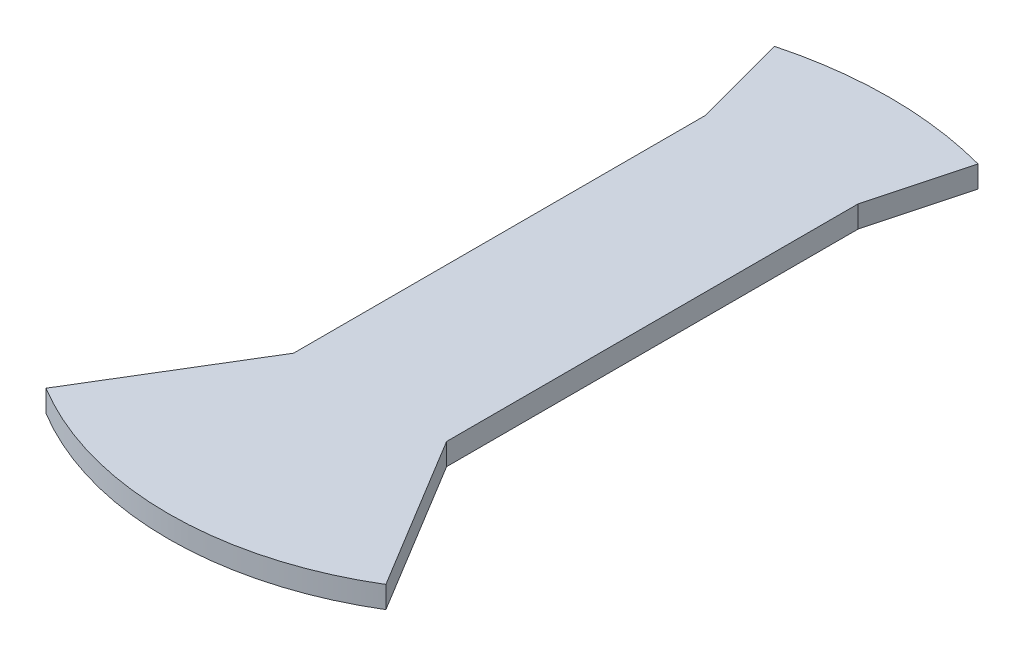
ISO-10303-21;
HEADER;
FILE_DESCRIPTION(('STEP AP214'),'2;1');
FILE_NAME('part.step','',(''),(''),'','','');
FILE_SCHEMA(('AUTOMOTIVE_DESIGN { 1 0 10303 214 1 1 1 1 }'));
ENDSEC;
DATA;
#1=APPLICATION_CONTEXT('core data for automotive mechanical design processes');
#2=APPLICATION_PROTOCOL_DEFINITION('international standard','automotive_design',2000,#1);
#3=PRODUCT_CONTEXT('',#1,'mechanical');
#4=PRODUCT('Part','Part','',(#3));
#5=PRODUCT_RELATED_PRODUCT_CATEGORY('part','',(#4));
#6=PRODUCT_DEFINITION_FORMATION('','',#4);
#7=PRODUCT_DEFINITION_CONTEXT('part definition',#1,'design');
#8=PRODUCT_DEFINITION('design','',#6,#7);
#9=PRODUCT_DEFINITION_SHAPE('','',#8);
#10=(LENGTH_UNIT() NAMED_UNIT(*) SI_UNIT(.MILLI.,.METRE.));
#11=(NAMED_UNIT(*) PLANE_ANGLE_UNIT() SI_UNIT($,.RADIAN.));
#12=(NAMED_UNIT(*) SI_UNIT($,.STERADIAN.) SOLID_ANGLE_UNIT());
#13=UNCERTAINTY_MEASURE_WITH_UNIT(LENGTH_MEASURE(1.E-05),#10,'distance_accuracy_value','');
#14=(GEOMETRIC_REPRESENTATION_CONTEXT(3) GLOBAL_UNCERTAINTY_ASSIGNED_CONTEXT((#13)) GLOBAL_UNIT_ASSIGNED_CONTEXT((#10,
#11,#12)) REPRESENTATION_CONTEXT('',''));
#15=CARTESIAN_POINT('',(0.,0.,0.));
#16=DIRECTION('',(0.,0.,1.));
#17=DIRECTION('',(1.,0.,0.));
#18=AXIS2_PLACEMENT_3D('',#15,#16,#17);
#19=CARTESIAN_POINT('',(0.,3.175,0.));
#20=DIRECTION('',(0.,-1.,0.));
#21=DIRECTION('',(0.,0.,-1.));
#22=AXIS2_PLACEMENT_3D('',#19,#20,#21);
#23=CYLINDRICAL_SURFACE('',#22,114.3);
#24=CARTESIAN_POINT('',(0.,-3.175,0.));
#25=DIRECTION('',(0.,1.,0.));
#26=DIRECTION('',(0.,0.,-1.));
#27=AXIS2_PLACEMENT_3D('',#24,#25,#26);
#28=CIRCLE('',#27,114.3);
#29=CARTESIAN_POINT('',(29.5830168552182,-3.175,-110.405321944841));
#30=VERTEX_POINT('',#29);
#31=CARTESIAN_POINT('',(-29.5830168552182,-3.175,-110.40532194484));
#32=VERTEX_POINT('',#31);
#33=EDGE_CURVE('E131',#30,#32,#28,.T.);
#34=ORIENTED_EDGE('',*,*,#33,.T.);
#35=DIRECTION('',(0.,-1.,0.));
#36=VECTOR('',#35,1.);
#37=CARTESIAN_POINT('',(-29.5830168552182,3.175,-110.40532194484));
#38=LINE('',#37,#36);
#39=CARTESIAN_POINT('',(-29.5830168552182,3.175,-110.40532194484));
#40=VERTEX_POINT('',#39);
#41=EDGE_CURVE('E11',#40,#32,#38,.T.);
#42=ORIENTED_EDGE('',*,*,#41,.F.);
#43=CARTESIAN_POINT('',(0.,3.175,0.));
#44=DIRECTION('',(0.,1.,0.));
#45=DIRECTION('',(0.,0.,-1.));
#46=AXIS2_PLACEMENT_3D('',#43,#44,#45);
#47=CIRCLE('',#46,114.3);
#48=CARTESIAN_POINT('',(29.5830168552182,3.175,-110.405321944841));
#49=VERTEX_POINT('',#48);
#50=EDGE_CURVE('E145',#49,#40,#47,.T.);
#51=ORIENTED_EDGE('',*,*,#50,.F.);
#52=DIRECTION('',(0.,-1.,0.));
#53=VECTOR('',#52,1.);
#54=CARTESIAN_POINT('',(29.5830168552182,3.175,-110.405321944841));
#55=LINE('',#54,#53);
#56=EDGE_CURVE('E127',#49,#30,#55,.T.);
#57=ORIENTED_EDGE('',*,*,#56,.T.);
#58=EDGE_LOOP('',(#34,#42,#51,#57));
#59=FACE_BOUND('',#58,.T.);
#60=ADVANCED_FACE('F35',(#59),#23,.T.);
#61=CARTESIAN_POINT('',(-29.5830168552182,3.175,-110.40532194484));
#62=DIRECTION('',(0.965925826289068,0.,-0.258819045102522));
#63=DIRECTION('',(-0.258819045102522,0.,-0.965925826289068));
#64=AXIS2_PLACEMENT_3D('',#61,#62,#63);
#65=PLANE('',#64);
#66=DIRECTION('',(0.258819045102522,0.,0.965925826289068));
#67=VECTOR('',#66,1.);
#68=CARTESIAN_POINT('',(-29.5830168552182,-3.175,-110.40532194484));
#69=LINE('',#68,#67);
#70=CARTESIAN_POINT('',(-22.225,-3.175,-82.944829198218));
#71=VERTEX_POINT('',#70);
#72=EDGE_CURVE('E134',#32,#71,#69,.T.);
#73=ORIENTED_EDGE('',*,*,#72,.T.);
#74=DIRECTION('',(0.,-1.,0.));
#75=VECTOR('',#74,1.);
#76=CARTESIAN_POINT('',(-22.225,3.175,-82.944829198218));
#77=LINE('',#76,#75);
#78=CARTESIAN_POINT('',(-22.225,3.175,-82.944829198218));
#79=VERTEX_POINT('',#78);
#80=EDGE_CURVE('E43',#79,#71,#77,.T.);
#81=ORIENTED_EDGE('',*,*,#80,.F.);
#82=DIRECTION('',(0.258819045102522,0.,0.965925826289068));
#83=VECTOR('',#82,1.);
#84=CARTESIAN_POINT('',(-29.5830168552182,3.175,-110.40532194484));
#85=LINE('',#84,#83);
#86=EDGE_CURVE('E94',#40,#79,#85,.T.);
#87=ORIENTED_EDGE('',*,*,#86,.F.);
#88=ORIENTED_EDGE('',*,*,#41,.T.);
#89=EDGE_LOOP('',(#73,#81,#87,#88));
#90=FACE_BOUND('',#89,.T.);
#91=ADVANCED_FACE('F180',(#90),#65,.F.);
#92=CARTESIAN_POINT('',(-22.225,3.175,-82.944829198218));
#93=DIRECTION('',(1.,0.,0.));
#94=DIRECTION('',(0.,0.,-1.));
#95=AXIS2_PLACEMENT_3D('',#92,#93,#94);
#96=PLANE('',#95);
#97=DIRECTION('',(0.,0.,1.));
#98=VECTOR('',#97,1.);
#99=CARTESIAN_POINT('',(-22.225,-3.175,-82.944829198218));
#100=LINE('',#99,#98);
#101=CARTESIAN_POINT('',(-22.225,-3.175,36.6590574958511));
#102=VERTEX_POINT('',#101);
#103=EDGE_CURVE('E136',#71,#102,#100,.T.);
#104=ORIENTED_EDGE('',*,*,#103,.T.);
#105=DIRECTION('',(0.,-1.,0.));
#106=VECTOR('',#105,1.);
#107=CARTESIAN_POINT('',(-22.225,3.175,36.6590574958511));
#108=LINE('',#107,#106);
#109=CARTESIAN_POINT('',(-22.225,3.175,36.6590574958511));
#110=VERTEX_POINT('',#109);
#111=EDGE_CURVE('E152',#110,#102,#108,.T.);
#112=ORIENTED_EDGE('',*,*,#111,.F.);
#113=DIRECTION('',(0.,0.,1.));
#114=VECTOR('',#113,1.);
#115=CARTESIAN_POINT('',(-22.225,3.175,-82.944829198218));
#116=LINE('',#115,#114);
#117=EDGE_CURVE('E160',#79,#110,#116,.T.);
#118=ORIENTED_EDGE('',*,*,#117,.F.);
#119=ORIENTED_EDGE('',*,*,#80,.T.);
#120=EDGE_LOOP('',(#104,#112,#118,#119));
#121=FACE_BOUND('',#120,.T.);
#122=ADVANCED_FACE('F158',(#121),#96,.F.);
#123=CARTESIAN_POINT('',(-22.225,3.175,36.6590574958511));
#124=DIRECTION('',(0.85512142026816,0.,0.51842777375307));
#125=DIRECTION('',(0.51842777375307,0.,-0.85512142026816));
#126=AXIS2_PLACEMENT_3D('',#123,#124,#125);
#127=PLANE('',#126);
#128=DIRECTION('',(-0.51842777375307,0.,0.85512142026816));
#129=VECTOR('',#128,1.);
#130=CARTESIAN_POINT('',(-22.225,-3.175,36.6590574958511));
#131=LINE('',#130,#129);
#132=CARTESIAN_POINT('',(-49.3802454499799,-3.175,81.4503152805423));
#133=VERTEX_POINT('',#132);
#134=EDGE_CURVE('E138',#102,#133,#131,.T.);
#135=ORIENTED_EDGE('',*,*,#134,.T.);
#136=DIRECTION('',(0.,-1.,0.));
#137=VECTOR('',#136,1.);
#138=CARTESIAN_POINT('',(-49.3802454499799,3.175,81.4503152805423));
#139=LINE('',#138,#137);
#140=CARTESIAN_POINT('',(-49.3802454499799,3.175,81.4503152805423));
#141=VERTEX_POINT('',#140);
#142=EDGE_CURVE('E149',#141,#133,#139,.T.);
#143=ORIENTED_EDGE('',*,*,#142,.F.);
#144=DIRECTION('',(-0.51842777375307,0.,0.85512142026816));
#145=VECTOR('',#144,1.);
#146=CARTESIAN_POINT('',(-22.225,3.175,36.6590574958511));
#147=LINE('',#146,#145);
#148=EDGE_CURVE('E172',#110,#141,#147,.T.);
#149=ORIENTED_EDGE('',*,*,#148,.F.);
#150=ORIENTED_EDGE('',*,*,#111,.T.);
#151=EDGE_LOOP('',(#135,#143,#149,#150));
#152=FACE_BOUND('',#151,.T.);
#153=ADVANCED_FACE('F168',(#152),#127,.F.);
#154=CARTESIAN_POINT('',(0.,3.175,0.));
#155=DIRECTION('',(0.,-1.,0.));
#156=DIRECTION('',(0.,0.,-1.));
#157=AXIS2_PLACEMENT_3D('',#154,#155,#156);
#158=CYLINDRICAL_SURFACE('',#157,95.25);
#159=CARTESIAN_POINT('',(0.,-3.175,0.));
#160=DIRECTION('',(0.,1.,0.));
#161=DIRECTION('',(0.,0.,1.));
#162=AXIS2_PLACEMENT_3D('',#159,#160,#161);
#163=CIRCLE('',#162,95.25);
#164=CARTESIAN_POINT('',(49.38024544998,-3.175,81.4503152805422));
#165=VERTEX_POINT('',#164);
#166=EDGE_CURVE('E140',#133,#165,#163,.T.);
#167=ORIENTED_EDGE('',*,*,#166,.T.);
#168=DIRECTION('',(0.,-1.,0.));
#169=VECTOR('',#168,1.);
#170=CARTESIAN_POINT('',(49.38024544998,3.175,81.4503152805422));
#171=LINE('',#170,#169);
#172=CARTESIAN_POINT('',(49.38024544998,3.175,81.4503152805422));
#173=VERTEX_POINT('',#172);
#174=EDGE_CURVE('E122',#173,#165,#171,.T.);
#175=ORIENTED_EDGE('',*,*,#174,.F.);
#176=CARTESIAN_POINT('',(0.,3.175,0.));
#177=DIRECTION('',(0.,1.,0.));
#178=DIRECTION('',(0.,0.,1.));
#179=AXIS2_PLACEMENT_3D('',#176,#177,#178);
#180=CIRCLE('',#179,95.25);
#181=EDGE_CURVE('E113',#141,#173,#180,.T.);
#182=ORIENTED_EDGE('',*,*,#181,.F.);
#183=ORIENTED_EDGE('',*,*,#142,.T.);
#184=EDGE_LOOP('',(#167,#175,#182,#183));
#185=FACE_BOUND('',#184,.T.);
#186=ADVANCED_FACE('F171',(#185),#158,.T.);
#187=CARTESIAN_POINT('',(22.225,3.175,36.659057495851));
#188=DIRECTION('',(-0.85512142026816,0.,0.51842777375307));
#189=DIRECTION('',(0.51842777375307,0.,0.85512142026816));
#190=AXIS2_PLACEMENT_3D('',#187,#188,#189);
#191=PLANE('',#190);
#192=DIRECTION('',(-0.51842777375307,0.,-0.85512142026816));
#193=VECTOR('',#192,1.);
#194=CARTESIAN_POINT('',(22.225,-3.175,36.659057495851));
#195=LINE('',#194,#193);
#196=CARTESIAN_POINT('',(22.225,-3.175,36.659057495851));
#197=VERTEX_POINT('',#196);
#198=EDGE_CURVE('E121',#165,#197,#195,.T.);
#199=ORIENTED_EDGE('',*,*,#198,.T.);
#200=DIRECTION('',(0.,-1.,0.));
#201=VECTOR('',#200,1.);
#202=CARTESIAN_POINT('',(22.225,3.175,36.659057495851));
#203=LINE('',#202,#201);
#204=CARTESIAN_POINT('',(22.225,3.175,36.659057495851));
#205=VERTEX_POINT('',#204);
#206=EDGE_CURVE('E118',#205,#197,#203,.T.);
#207=ORIENTED_EDGE('',*,*,#206,.F.);
#208=DIRECTION('',(-0.51842777375307,0.,-0.85512142026816));
#209=VECTOR('',#208,1.);
#210=CARTESIAN_POINT('',(22.225,3.175,36.659057495851));
#211=LINE('',#210,#209);
#212=EDGE_CURVE('E107',#173,#205,#211,.T.);
#213=ORIENTED_EDGE('',*,*,#212,.F.);
#214=ORIENTED_EDGE('',*,*,#174,.T.);
#215=EDGE_LOOP('',(#199,#207,#213,#214));
#216=FACE_BOUND('',#215,.T.);
#217=ADVANCED_FACE('F119',(#216),#191,.F.);
#218=CARTESIAN_POINT('',(22.225,3.175,-82.944829198218));
#219=DIRECTION('',(-1.,0.,0.));
#220=DIRECTION('',(0.,0.,1.));
#221=AXIS2_PLACEMENT_3D('',#218,#219,#220);
#222=PLANE('',#221);
#223=DIRECTION('',(0.,0.,-1.));
#224=VECTOR('',#223,1.);
#225=CARTESIAN_POINT('',(22.225,-3.175,-82.944829198218));
#226=LINE('',#225,#224);
#227=CARTESIAN_POINT('',(22.225,-3.175,-82.944829198218));
#228=VERTEX_POINT('',#227);
#229=EDGE_CURVE('E80',#197,#228,#226,.T.);
#230=ORIENTED_EDGE('',*,*,#229,.T.);
#231=DIRECTION('',(0.,-1.,0.));
#232=VECTOR('',#231,1.);
#233=CARTESIAN_POINT('',(22.225,3.175,-82.944829198218));
#234=LINE('',#233,#232);
#235=CARTESIAN_POINT('',(22.225,3.175,-82.944829198218));
#236=VERTEX_POINT('',#235);
#237=EDGE_CURVE('E123',#236,#228,#234,.T.);
#238=ORIENTED_EDGE('',*,*,#237,.F.);
#239=DIRECTION('',(0.,0.,-1.));
#240=VECTOR('',#239,1.);
#241=CARTESIAN_POINT('',(22.225,3.175,-82.944829198218));
#242=LINE('',#241,#240);
#243=EDGE_CURVE('E111',#205,#236,#242,.T.);
#244=ORIENTED_EDGE('',*,*,#243,.F.);
#245=ORIENTED_EDGE('',*,*,#206,.T.);
#246=EDGE_LOOP('',(#230,#238,#244,#245));
#247=FACE_BOUND('',#246,.T.);
#248=ADVANCED_FACE('F125',(#247),#222,.F.);
#249=CARTESIAN_POINT('',(22.225,3.175,-82.944829198218));
#250=DIRECTION('',(-0.965925826289068,0.,-0.258819045102521));
#251=DIRECTION('',(-0.258819045102521,0.,0.965925826289068));
#252=AXIS2_PLACEMENT_3D('',#249,#250,#251);
#253=PLANE('',#252);
#254=DIRECTION('',(0.258819045102521,0.,-0.965925826289068));
#255=VECTOR('',#254,1.);
#256=CARTESIAN_POINT('',(22.225,-3.175,-82.944829198218));
#257=LINE('',#256,#255);
#258=EDGE_CURVE('E86',#228,#30,#257,.T.);
#259=ORIENTED_EDGE('',*,*,#258,.T.);
#260=ORIENTED_EDGE('',*,*,#56,.F.);
#261=DIRECTION('',(0.258819045102521,0.,-0.965925826289068));
#262=VECTOR('',#261,1.);
#263=CARTESIAN_POINT('',(22.225,3.175,-82.944829198218));
#264=LINE('',#263,#262);
#265=EDGE_CURVE('E51',#236,#49,#264,.T.);
#266=ORIENTED_EDGE('',*,*,#265,.F.);
#267=ORIENTED_EDGE('',*,*,#237,.T.);
#268=EDGE_LOOP('',(#259,#260,#266,#267));
#269=FACE_BOUND('',#268,.T.);
#270=ADVANCED_FACE('F196',(#269),#253,.F.);
#271=CARTESIAN_POINT('',(0.,3.175,0.));
#272=DIRECTION('',(0.,-1.,0.));
#273=DIRECTION('',(0.,0.,-1.));
#274=AXIS2_PLACEMENT_3D('',#271,#272,#273);
#275=PLANE('',#274);
#276=ORIENTED_EDGE('',*,*,#50,.T.);
#277=ORIENTED_EDGE('',*,*,#86,.T.);
#278=ORIENTED_EDGE('',*,*,#117,.T.);
#279=ORIENTED_EDGE('',*,*,#148,.T.);
#280=ORIENTED_EDGE('',*,*,#181,.T.);
#281=ORIENTED_EDGE('',*,*,#212,.T.);
#282=ORIENTED_EDGE('',*,*,#243,.T.);
#283=ORIENTED_EDGE('',*,*,#265,.T.);
#284=EDGE_LOOP('',(#276,#277,#278,#279,#280,#281,#282,#283));
#285=FACE_BOUND('',#284,.T.);
#286=ADVANCED_FACE('F109',(#285),#275,.F.);
#287=CARTESIAN_POINT('',(0.,-3.175,0.));
#288=DIRECTION('',(0.,-1.,0.));
#289=DIRECTION('',(0.,0.,-1.));
#290=AXIS2_PLACEMENT_3D('',#287,#288,#289);
#291=PLANE('',#290);
#292=ORIENTED_EDGE('',*,*,#33,.F.);
#293=ORIENTED_EDGE('',*,*,#258,.F.);
#294=ORIENTED_EDGE('',*,*,#229,.F.);
#295=ORIENTED_EDGE('',*,*,#198,.F.);
#296=ORIENTED_EDGE('',*,*,#166,.F.);
#297=ORIENTED_EDGE('',*,*,#134,.F.);
#298=ORIENTED_EDGE('',*,*,#103,.F.);
#299=ORIENTED_EDGE('',*,*,#72,.F.);
#300=EDGE_LOOP('',(#292,#293,#294,#295,#296,#297,#298,#299));
#301=FACE_BOUND('',#300,.T.);
#302=ADVANCED_FACE('F164',(#301),#291,.T.);
#303=CLOSED_SHELL('',(#60,#91,#122,#153,#186,#217,#248,#270,#286,#302));
#304=MANIFOLD_SOLID_BREP('B2',#303);
#305=ADVANCED_BREP_SHAPE_REPRESENTATION('',(#18,#304),#14);
#306=SHAPE_DEFINITION_REPRESENTATION(#9,#305);
ENDSEC;
END-ISO-10303-21;
